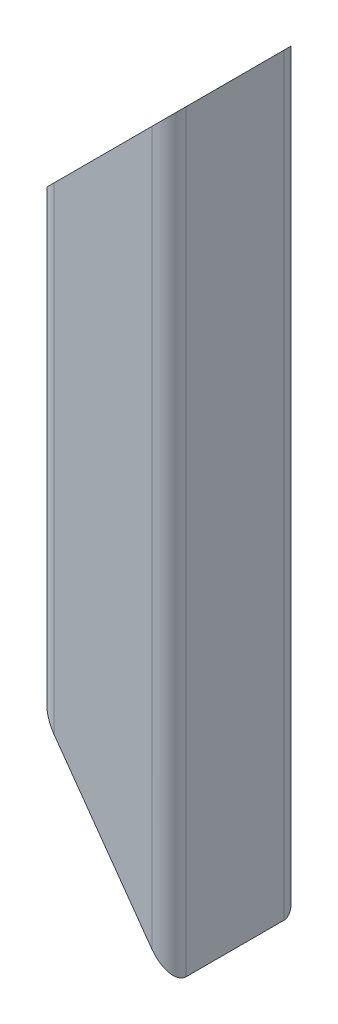
ISO-10303-21;
HEADER;
FILE_DESCRIPTION(('STEP AP214'),'2;1');
FILE_NAME('part.step','',(''),(''),'','','');
FILE_SCHEMA(('AUTOMOTIVE_DESIGN { 1 0 10303 214 1 1 1 1 }'));
ENDSEC;
DATA;
#1=APPLICATION_CONTEXT('core data for automotive mechanical design processes');
#2=APPLICATION_PROTOCOL_DEFINITION('international standard','automotive_design',2000,#1);
#3=PRODUCT_CONTEXT('',#1,'mechanical');
#4=PRODUCT('Part','Part','',(#3));
#5=PRODUCT_RELATED_PRODUCT_CATEGORY('part','',(#4));
#6=PRODUCT_DEFINITION_FORMATION('','',#4);
#7=PRODUCT_DEFINITION_CONTEXT('part definition',#1,'design');
#8=PRODUCT_DEFINITION('design','',#6,#7);
#9=PRODUCT_DEFINITION_SHAPE('','',#8);
#10=(LENGTH_UNIT() NAMED_UNIT(*) SI_UNIT(.MILLI.,.METRE.));
#11=(NAMED_UNIT(*) PLANE_ANGLE_UNIT() SI_UNIT($,.RADIAN.));
#12=(NAMED_UNIT(*) SI_UNIT($,.STERADIAN.) SOLID_ANGLE_UNIT());
#13=UNCERTAINTY_MEASURE_WITH_UNIT(LENGTH_MEASURE(1.E-05),#10,'distance_accuracy_value','');
#14=(GEOMETRIC_REPRESENTATION_CONTEXT(3) GLOBAL_UNCERTAINTY_ASSIGNED_CONTEXT((#13)) GLOBAL_UNIT_ASSIGNED_CONTEXT((#10,
#11,#12)) REPRESENTATION_CONTEXT('',''));
#15=CARTESIAN_POINT('',(0.,0.,0.));
#16=DIRECTION('',(0.,0.,1.));
#17=DIRECTION('',(1.,0.,0.));
#18=AXIS2_PLACEMENT_3D('',#15,#16,#17);
#19=CARTESIAN_POINT('',(9.52499999999999,144.78,-6.22299999999999));
#20=DIRECTION('',(-1.,0.,0.));
#21=DIRECTION('',(0.,0.,1.));
#22=AXIS2_PLACEMENT_3D('',#19,#20,#21);
#23=PLANE('',#22);
#24=DIRECTION('',(0.,0.,1.));
#25=VECTOR('',#24,1.);
#26=CARTESIAN_POINT('',(9.52499999999999,141.605,-6.22299999999999));
#27=LINE('',#26,#25);
#28=CARTESIAN_POINT('',(9.525,141.605,-19.177));
#29=VERTEX_POINT('',#28);
#30=CARTESIAN_POINT('',(9.52499999999999,141.605,-6.22299999999999));
#31=VERTEX_POINT('',#30);
#32=EDGE_CURVE('E11',#29,#31,#27,.T.);
#33=ORIENTED_EDGE('',*,*,#32,.F.);
#34=DIRECTION('',(0.,-1.,0.));
#35=VECTOR('',#34,1.);
#36=CARTESIAN_POINT('',(9.525,144.78,-19.177));
#37=LINE('',#36,#35);
#38=CARTESIAN_POINT('',(9.525,4.44500000000002,-19.177));
#39=VERTEX_POINT('',#38);
#40=EDGE_CURVE('E204',#29,#39,#37,.T.);
#41=ORIENTED_EDGE('',*,*,#40,.T.);
#42=DIRECTION('',(0.,0.,-1.));
#43=VECTOR('',#42,1.);
#44=CARTESIAN_POINT('',(9.52499999999999,4.44500000000003,-6.22299999999989));
#45=LINE('',#44,#43);
#46=CARTESIAN_POINT('',(9.52499999999999,4.44500000000003,-6.22299999999999));
#47=VERTEX_POINT('',#46);
#48=EDGE_CURVE('E44',#47,#39,#45,.T.);
#49=ORIENTED_EDGE('',*,*,#48,.F.);
#50=DIRECTION('',(0.,-1.,0.));
#51=VECTOR('',#50,1.);
#52=CARTESIAN_POINT('',(9.52499999999999,144.78,-6.22299999999999));
#53=LINE('',#52,#51);
#54=EDGE_CURVE('E210',#31,#47,#53,.T.);
#55=ORIENTED_EDGE('',*,*,#54,.F.);
#56=EDGE_LOOP('',(#33,#41,#49,#55));
#57=FACE_BOUND('',#56,.T.);
#58=ADVANCED_FACE('F36',(#57),#23,.T.);
#59=CARTESIAN_POINT('',(6.477,144.78,-6.22299999999999));
#60=DIRECTION('',(0.,-1.,0.));
#61=DIRECTION('',(0.,0.,-1.));
#62=AXIS2_PLACEMENT_3D('',#59,#60,#61);
#63=CYLINDRICAL_SURFACE('',#62,3.048);
#64=CARTESIAN_POINT('',(6.477,138.557,-6.22299999999999));
#65=DIRECTION('',(0.707106781186554,-0.707106781186541,0.));
#66=DIRECTION('',(-0.707106781186541,-0.707106781186554,0.));
#67=AXIS2_PLACEMENT_3D('',#64,#65,#66);
#68=ELLIPSE('',#67,4.31052293811323,3.048);
#69=CARTESIAN_POINT('',(6.477,138.557,-3.17499999999999));
#70=VERTEX_POINT('',#69);
#71=EDGE_CURVE('E266',#31,#70,#68,.T.);
#72=ORIENTED_EDGE('',*,*,#71,.F.);
#73=ORIENTED_EDGE('',*,*,#54,.T.);
#74=CARTESIAN_POINT('',(6.477,8.71220000000003,-6.22299999999999));
#75=DIRECTION('',(0.813733471206735,0.581238193719096,0.));
#76=DIRECTION('',(0.581238193719096,-0.813733471206735,0.));
#77=AXIS2_PLACEMENT_3D('',#74,#75,#76);
#78=ELLIPSE('',#77,5.24397748278918,3.048);
#79=CARTESIAN_POINT('',(6.477,8.71220000000003,-3.17499999999999));
#80=VERTEX_POINT('',#79);
#81=EDGE_CURVE('E194',#80,#47,#78,.T.);
#82=ORIENTED_EDGE('',*,*,#81,.F.);
#83=DIRECTION('',(0.,-1.,0.));
#84=VECTOR('',#83,1.);
#85=CARTESIAN_POINT('',(6.477,144.78,-3.17499999999999));
#86=LINE('',#85,#84);
#87=EDGE_CURVE('E213',#70,#80,#86,.T.);
#88=ORIENTED_EDGE('',*,*,#87,.F.);
#89=EDGE_LOOP('',(#72,#73,#82,#88));
#90=FACE_BOUND('',#89,.T.);
#91=ADVANCED_FACE('F309',(#90),#63,.F.);
#92=CARTESIAN_POINT('',(-6.477,144.78,-3.17499999999999));
#93=DIRECTION('',(0.,0.,-1.));
#94=DIRECTION('',(-1.,0.,0.));
#95=AXIS2_PLACEMENT_3D('',#92,#93,#94);
#96=PLANE('',#95);
#97=DIRECTION('',(-0.707106781186541,-0.707106781186554,0.));
#98=VECTOR('',#97,1.);
#99=CARTESIAN_POINT('',(3.11150000000017,135.1915,-3.17499999999999));
#100=LINE('',#99,#98);
#101=CARTESIAN_POINT('',(-6.477,125.603,-3.17499999999999));
#102=VERTEX_POINT('',#101);
#103=EDGE_CURVE('E264',#70,#102,#100,.T.);
#104=ORIENTED_EDGE('',*,*,#103,.F.);
#105=ORIENTED_EDGE('',*,*,#87,.T.);
#106=DIRECTION('',(0.581238193719096,-0.813733471206735,0.));
#107=VECTOR('',#106,1.);
#108=CARTESIAN_POINT('',(-62.2557432432432,104.938040540541,-3.17499999999999));
#109=LINE('',#108,#107);
#110=CARTESIAN_POINT('',(-6.477,26.8478,-3.17499999999999));
#111=VERTEX_POINT('',#110);
#112=EDGE_CURVE('E279',#111,#80,#109,.T.);
#113=ORIENTED_EDGE('',*,*,#112,.F.);
#114=DIRECTION('',(0.,-1.,0.));
#115=VECTOR('',#114,1.);
#116=CARTESIAN_POINT('',(-6.477,144.78,-3.175));
#117=LINE('',#116,#115);
#118=EDGE_CURVE('E222',#102,#111,#117,.T.);
#119=ORIENTED_EDGE('',*,*,#118,.F.);
#120=EDGE_LOOP('',(#104,#105,#113,#119));
#121=FACE_BOUND('',#120,.T.);
#122=ADVANCED_FACE('F314',(#121),#96,.T.);
#123=CARTESIAN_POINT('',(-6.477,144.78,-6.22299999999999));
#124=DIRECTION('',(0.,-1.,0.));
#125=DIRECTION('',(0.,0.,-1.));
#126=AXIS2_PLACEMENT_3D('',#123,#124,#125);
#127=CYLINDRICAL_SURFACE('',#126,3.04799999999999);
#128=CARTESIAN_POINT('',(-6.477,125.603,-6.22299999999999));
#129=DIRECTION('',(0.707106781186554,-0.707106781186541,0.));
#130=DIRECTION('',(-0.707106781186541,-0.707106781186554,0.));
#131=AXIS2_PLACEMENT_3D('',#128,#129,#130);
#132=ELLIPSE('',#131,4.31052293811322,3.04799999999999);
#133=CARTESIAN_POINT('',(-9.52499999999999,122.555,-6.22299999999999));
#134=VERTEX_POINT('',#133);
#135=EDGE_CURVE('E262',#102,#134,#132,.T.);
#136=ORIENTED_EDGE('',*,*,#135,.F.);
#137=ORIENTED_EDGE('',*,*,#118,.T.);
#138=CARTESIAN_POINT('',(-6.477,26.8478,-6.22299999999999));
#139=DIRECTION('',(0.813733471206735,0.581238193719096,0.));
#140=DIRECTION('',(0.581238193719096,-0.813733471206735,0.));
#141=AXIS2_PLACEMENT_3D('',#138,#139,#140);
#142=ELLIPSE('',#141,5.24397748278917,3.04799999999999);
#143=CARTESIAN_POINT('',(-9.52499999999999,31.115,-6.22299999999999));
#144=VERTEX_POINT('',#143);
#145=EDGE_CURVE('E277',#144,#111,#142,.T.);
#146=ORIENTED_EDGE('',*,*,#145,.F.);
#147=DIRECTION('',(0.,-1.,0.));
#148=VECTOR('',#147,1.);
#149=CARTESIAN_POINT('',(-9.52499999999999,144.78,-6.22299999999999));
#150=LINE('',#149,#148);
#151=EDGE_CURVE('E225',#134,#144,#150,.T.);
#152=ORIENTED_EDGE('',*,*,#151,.F.);
#153=EDGE_LOOP('',(#136,#137,#146,#152));
#154=FACE_BOUND('',#153,.T.);
#155=ADVANCED_FACE('F322',(#154),#127,.F.);
#156=CARTESIAN_POINT('',(-9.52499999999999,144.78,-6.22299999999999));
#157=DIRECTION('',(1.,0.,0.));
#158=DIRECTION('',(0.,0.,-1.));
#159=AXIS2_PLACEMENT_3D('',#156,#157,#158);
#160=PLANE('',#159);
#161=DIRECTION('',(0.,0.,-1.));
#162=VECTOR('',#161,1.);
#163=CARTESIAN_POINT('',(-9.52499999999999,122.555,-6.22299999999999));
#164=LINE('',#163,#162);
#165=CARTESIAN_POINT('',(-9.52499999999999,122.555,-19.177));
#166=VERTEX_POINT('',#165);
#167=EDGE_CURVE('E260',#134,#166,#164,.T.);
#168=ORIENTED_EDGE('',*,*,#167,.F.);
#169=ORIENTED_EDGE('',*,*,#151,.T.);
#170=DIRECTION('',(0.,0.,1.));
#171=VECTOR('',#170,1.);
#172=CARTESIAN_POINT('',(-9.52499999999999,31.115,-6.22299999999999));
#173=LINE('',#172,#171);
#174=CARTESIAN_POINT('',(-9.52499999999999,31.115,-19.177));
#175=VERTEX_POINT('',#174);
#176=EDGE_CURVE('E275',#175,#144,#173,.T.);
#177=ORIENTED_EDGE('',*,*,#176,.F.);
#178=DIRECTION('',(0.,-1.,0.));
#179=VECTOR('',#178,1.);
#180=CARTESIAN_POINT('',(-9.525,144.78,-19.177));
#181=LINE('',#180,#179);
#182=EDGE_CURVE('E228',#166,#175,#181,.T.);
#183=ORIENTED_EDGE('',*,*,#182,.F.);
#184=EDGE_LOOP('',(#168,#169,#177,#183));
#185=FACE_BOUND('',#184,.T.);
#186=ADVANCED_FACE('F326',(#185),#160,.T.);
#187=CARTESIAN_POINT('',(-6.47700000000001,144.78,-19.177));
#188=DIRECTION('',(0.,-1.,0.));
#189=DIRECTION('',(0.,0.,-1.));
#190=AXIS2_PLACEMENT_3D('',#187,#188,#189);
#191=CYLINDRICAL_SURFACE('',#190,3.04799999999999);
#192=CARTESIAN_POINT('',(-6.47700000000001,125.603,-19.177));
#193=DIRECTION('',(0.707106781186554,-0.707106781186541,0.));
#194=DIRECTION('',(-0.707106781186541,-0.707106781186554,0.));
#195=AXIS2_PLACEMENT_3D('',#192,#193,#194);
#196=ELLIPSE('',#195,4.31052293811322,3.04799999999999);
#197=CARTESIAN_POINT('',(-6.477,125.603,-22.225));
#198=VERTEX_POINT('',#197);
#199=EDGE_CURVE('E258',#166,#198,#196,.T.);
#200=ORIENTED_EDGE('',*,*,#199,.F.);
#201=ORIENTED_EDGE('',*,*,#182,.T.);
#202=CARTESIAN_POINT('',(-6.47700000000001,26.8478,-19.177));
#203=DIRECTION('',(0.813733471206735,0.581238193719096,0.));
#204=DIRECTION('',(0.581238193719096,-0.813733471206735,0.));
#205=AXIS2_PLACEMENT_3D('',#202,#203,#204);
#206=ELLIPSE('',#205,5.24397748278917,3.04799999999999);
#207=CARTESIAN_POINT('',(-6.477,26.8478,-22.225));
#208=VERTEX_POINT('',#207);
#209=EDGE_CURVE('E273',#208,#175,#206,.T.);
#210=ORIENTED_EDGE('',*,*,#209,.F.);
#211=DIRECTION('',(0.,-1.,0.));
#212=VECTOR('',#211,1.);
#213=CARTESIAN_POINT('',(-6.477,144.78,-22.225));
#214=LINE('',#213,#212);
#215=EDGE_CURVE('E231',#198,#208,#214,.T.);
#216=ORIENTED_EDGE('',*,*,#215,.F.);
#217=EDGE_LOOP('',(#200,#201,#210,#216));
#218=FACE_BOUND('',#217,.T.);
#219=ADVANCED_FACE('F330',(#218),#191,.F.);
#220=CARTESIAN_POINT('',(-6.477,144.78,-22.225));
#221=DIRECTION('',(0.,0.,1.));
#222=DIRECTION('',(1.,0.,0.));
#223=AXIS2_PLACEMENT_3D('',#220,#221,#222);
#224=PLANE('',#223);
#225=DIRECTION('',(0.707106781186541,0.707106781186554,0.));
#226=VECTOR('',#225,1.);
#227=CARTESIAN_POINT('',(3.11150000000017,135.1915,-22.225));
#228=LINE('',#227,#226);
#229=CARTESIAN_POINT('',(6.477,138.557,-22.225));
#230=VERTEX_POINT('',#229);
#231=EDGE_CURVE('E256',#198,#230,#228,.T.);
#232=ORIENTED_EDGE('',*,*,#231,.F.);
#233=ORIENTED_EDGE('',*,*,#215,.T.);
#234=DIRECTION('',(-0.581238193719096,0.813733471206735,0.));
#235=VECTOR('',#234,1.);
#236=CARTESIAN_POINT('',(-62.2557432432432,104.938040540541,-22.225));
#237=LINE('',#236,#235);
#238=CARTESIAN_POINT('',(6.47699999999999,8.71220000000003,-22.225));
#239=VERTEX_POINT('',#238);
#240=EDGE_CURVE('E207',#239,#208,#237,.T.);
#241=ORIENTED_EDGE('',*,*,#240,.F.);
#242=DIRECTION('',(0.,-1.,0.));
#243=VECTOR('',#242,1.);
#244=CARTESIAN_POINT('',(6.477,144.78,-22.225));
#245=LINE('',#244,#243);
#246=EDGE_CURVE('E206',#230,#239,#245,.T.);
#247=ORIENTED_EDGE('',*,*,#246,.F.);
#248=EDGE_LOOP('',(#232,#233,#241,#247));
#249=FACE_BOUND('',#248,.T.);
#250=ADVANCED_FACE('F334',(#249),#224,.T.);
#251=CARTESIAN_POINT('',(6.477,144.78,-19.177));
#252=DIRECTION('',(0.,-1.,0.));
#253=DIRECTION('',(0.,0.,-1.));
#254=AXIS2_PLACEMENT_3D('',#251,#252,#253);
#255=CYLINDRICAL_SURFACE('',#254,3.048);
#256=CARTESIAN_POINT('',(6.477,138.557,-19.177));
#257=DIRECTION('',(0.707106781186554,-0.707106781186541,0.));
#258=DIRECTION('',(-0.707106781186541,-0.707106781186554,0.));
#259=AXIS2_PLACEMENT_3D('',#256,#257,#258);
#260=ELLIPSE('',#259,4.31052293811323,3.048);
#261=EDGE_CURVE('E254',#230,#29,#260,.T.);
#262=ORIENTED_EDGE('',*,*,#261,.F.);
#263=ORIENTED_EDGE('',*,*,#246,.T.);
#264=CARTESIAN_POINT('',(6.477,8.71220000000003,-19.177));
#265=DIRECTION('',(0.813733471206735,0.581238193719096,0.));
#266=DIRECTION('',(0.581238193719096,-0.813733471206735,0.));
#267=AXIS2_PLACEMENT_3D('',#264,#265,#266);
#268=ELLIPSE('',#267,5.24397748278919,3.048);
#269=EDGE_CURVE('E164',#39,#239,#268,.T.);
#270=ORIENTED_EDGE('',*,*,#269,.F.);
#271=ORIENTED_EDGE('',*,*,#40,.F.);
#272=EDGE_LOOP('',(#262,#263,#270,#271));
#273=FACE_BOUND('',#272,.T.);
#274=ADVANCED_FACE('F203',(#273),#255,.F.);
#275=CARTESIAN_POINT('',(12.7,0.,-25.4));
#276=DIRECTION('',(0.813733471206735,0.581238193719096,0.));
#277=DIRECTION('',(-0.581238193719096,0.813733471206735,0.));
#278=AXIS2_PLACEMENT_3D('',#275,#276,#277);
#279=PLANE('',#278);
#280=ORIENTED_EDGE('',*,*,#269,.T.);
#281=ORIENTED_EDGE('',*,*,#240,.T.);
#282=ORIENTED_EDGE('',*,*,#209,.T.);
#283=ORIENTED_EDGE('',*,*,#176,.T.);
#284=ORIENTED_EDGE('',*,*,#145,.T.);
#285=ORIENTED_EDGE('',*,*,#112,.T.);
#286=ORIENTED_EDGE('',*,*,#81,.T.);
#287=ORIENTED_EDGE('',*,*,#48,.T.);
#288=EDGE_LOOP('',(#280,#281,#282,#283,#284,#285,#286,#287));
#289=FACE_BOUND('',#288,.T.);
#290=DIRECTION('',(-0.581238193719096,0.813733471206735,0.));
#291=VECTOR('',#290,1.);
#292=CARTESIAN_POINT('',(12.7,0.,0.));
#293=LINE('',#292,#291);
#294=CARTESIAN_POINT('',(9.398,4.6228,0.));
#295=VERTEX_POINT('',#294);
#296=CARTESIAN_POINT('',(-9.39799999999999,30.9372,0.));
#297=VERTEX_POINT('',#296);
#298=EDGE_CURVE('E145',#295,#297,#293,.T.);
#299=ORIENTED_EDGE('',*,*,#298,.T.);
#300=CARTESIAN_POINT('',(-9.398,30.9372,-3.302));
#301=DIRECTION('',(0.813733471206735,0.581238193719096,0.));
#302=DIRECTION('',(0.581238193719096,-0.813733471206735,0.));
#303=AXIS2_PLACEMENT_3D('',#300,#301,#302);
#304=ELLIPSE('',#303,5.68097560635495,3.302);
#305=CARTESIAN_POINT('',(-12.7,35.56,-3.302));
#306=VERTEX_POINT('',#305);
#307=EDGE_CURVE('E148',#306,#297,#304,.T.);
#308=ORIENTED_EDGE('',*,*,#307,.F.);
#309=DIRECTION('',(0.,0.,1.));
#310=VECTOR('',#309,1.);
#311=CARTESIAN_POINT('',(-12.7,35.56,-25.4));
#312=LINE('',#311,#310);
#313=CARTESIAN_POINT('',(-12.7,35.56,-22.098));
#314=VERTEX_POINT('',#313);
#315=EDGE_CURVE('E283',#314,#306,#312,.T.);
#316=ORIENTED_EDGE('',*,*,#315,.F.);
#317=CARTESIAN_POINT('',(-9.398,30.9372,-22.098));
#318=DIRECTION('',(0.813733471206735,0.581238193719096,0.));
#319=DIRECTION('',(0.581238193719096,-0.813733471206735,0.));
#320=AXIS2_PLACEMENT_3D('',#317,#318,#319);
#321=ELLIPSE('',#320,5.68097560635495,3.302);
#322=CARTESIAN_POINT('',(-9.39799999999999,30.9372,-25.4));
#323=VERTEX_POINT('',#322);
#324=EDGE_CURVE('E163',#323,#314,#321,.T.);
#325=ORIENTED_EDGE('',*,*,#324,.F.);
#326=DIRECTION('',(-0.581238193719096,0.813733471206735,0.));
#327=VECTOR('',#326,1.);
#328=CARTESIAN_POINT('',(12.7,0.,-25.4));
#329=LINE('',#328,#327);
#330=CARTESIAN_POINT('',(9.398,4.6228,-25.4));
#331=VERTEX_POINT('',#330);
#332=EDGE_CURVE('E154',#331,#323,#329,.T.);
#333=ORIENTED_EDGE('',*,*,#332,.F.);
#334=CARTESIAN_POINT('',(9.39799999999999,4.62280000000001,-22.098));
#335=DIRECTION('',(0.813733471206735,0.581238193719096,0.));
#336=DIRECTION('',(0.581238193719096,-0.813733471206735,0.));
#337=AXIS2_PLACEMENT_3D('',#334,#335,#336);
#338=ELLIPSE('',#337,5.68097560635495,3.302);
#339=CARTESIAN_POINT('',(12.7,0.,-22.098));
#340=VERTEX_POINT('',#339);
#341=EDGE_CURVE('E247',#340,#331,#338,.T.);
#342=ORIENTED_EDGE('',*,*,#341,.F.);
#343=DIRECTION('',(0.,0.,-1.));
#344=VECTOR('',#343,1.);
#345=CARTESIAN_POINT('',(12.7,0.,-3.302));
#346=LINE('',#345,#344);
#347=CARTESIAN_POINT('',(12.7,0.,-3.302));
#348=VERTEX_POINT('',#347);
#349=EDGE_CURVE('E235',#348,#340,#346,.T.);
#350=ORIENTED_EDGE('',*,*,#349,.F.);
#351=CARTESIAN_POINT('',(9.398,4.62280000000001,-3.302));
#352=DIRECTION('',(0.813733471206735,0.581238193719096,0.));
#353=DIRECTION('',(0.581238193719096,-0.813733471206735,0.));
#354=AXIS2_PLACEMENT_3D('',#351,#352,#353);
#355=ELLIPSE('',#354,5.68097560635495,3.302);
#356=EDGE_CURVE('E59',#295,#348,#355,.T.);
#357=ORIENTED_EDGE('',*,*,#356,.F.);
#358=EDGE_LOOP('',(#299,#308,#316,#325,#333,#342,#350,#357));
#359=FACE_BOUND('',#358,.T.);
#360=ADVANCED_FACE('F147',(#289,#359),#279,.F.);
#361=CARTESIAN_POINT('',(12.7,144.78,-25.4));
#362=DIRECTION('',(0.707106781186554,-0.707106781186541,0.));
#363=DIRECTION('',(0.707106781186541,0.707106781186554,0.));
#364=AXIS2_PLACEMENT_3D('',#361,#362,#363);
#365=PLANE('',#364);
#366=ORIENTED_EDGE('',*,*,#261,.T.);
#367=ORIENTED_EDGE('',*,*,#32,.T.);
#368=ORIENTED_EDGE('',*,*,#71,.T.);
#369=ORIENTED_EDGE('',*,*,#103,.T.);
#370=ORIENTED_EDGE('',*,*,#135,.T.);
#371=ORIENTED_EDGE('',*,*,#167,.T.);
#372=ORIENTED_EDGE('',*,*,#199,.T.);
#373=ORIENTED_EDGE('',*,*,#231,.T.);
#374=EDGE_LOOP('',(#366,#367,#368,#369,#370,#371,#372,#373));
#375=FACE_BOUND('',#374,.T.);
#376=DIRECTION('',(0.,0.,-1.));
#377=VECTOR('',#376,1.);
#378=CARTESIAN_POINT('',(12.7,144.78,-3.302));
#379=LINE('',#378,#377);
#380=CARTESIAN_POINT('',(12.7,144.78,-3.302));
#381=VERTEX_POINT('',#380);
#382=CARTESIAN_POINT('',(12.7,144.78,-22.098));
#383=VERTEX_POINT('',#382);
#384=EDGE_CURVE('E172',#381,#383,#379,.T.);
#385=ORIENTED_EDGE('',*,*,#384,.T.);
#386=CARTESIAN_POINT('',(9.39799999999999,141.478,-22.098));
#387=DIRECTION('',(0.707106781186554,-0.707106781186541,0.));
#388=DIRECTION('',(-0.707106781186541,-0.707106781186554,0.));
#389=AXIS2_PLACEMENT_3D('',#386,#387,#388);
#390=ELLIPSE('',#389,4.669733182956,3.302);
#391=CARTESIAN_POINT('',(9.398,141.478,-25.4));
#392=VERTEX_POINT('',#391);
#393=EDGE_CURVE('E216',#392,#383,#390,.T.);
#394=ORIENTED_EDGE('',*,*,#393,.F.);
#395=DIRECTION('',(0.707106781186541,0.707106781186554,0.));
#396=VECTOR('',#395,1.);
#397=CARTESIAN_POINT('',(12.7,144.78,-25.4));
#398=LINE('',#397,#396);
#399=CARTESIAN_POINT('',(-9.39800000000001,122.682,-25.4));
#400=VERTEX_POINT('',#399);
#401=EDGE_CURVE('E288',#400,#392,#398,.T.);
#402=ORIENTED_EDGE('',*,*,#401,.F.);
#403=CARTESIAN_POINT('',(-9.398,122.682,-22.098));
#404=DIRECTION('',(0.707106781186554,-0.707106781186541,0.));
#405=DIRECTION('',(-0.707106781186541,-0.707106781186554,0.));
#406=AXIS2_PLACEMENT_3D('',#403,#404,#405);
#407=ELLIPSE('',#406,4.669733182956,3.302);
#408=CARTESIAN_POINT('',(-12.7,119.38,-22.098));
#409=VERTEX_POINT('',#408);
#410=EDGE_CURVE('E249',#409,#400,#407,.T.);
#411=ORIENTED_EDGE('',*,*,#410,.F.);
#412=DIRECTION('',(0.,0.,1.));
#413=VECTOR('',#412,1.);
#414=CARTESIAN_POINT('',(-12.7,119.38,-25.4));
#415=LINE('',#414,#413);
#416=CARTESIAN_POINT('',(-12.7,119.38,-3.302));
#417=VERTEX_POINT('',#416);
#418=EDGE_CURVE('E282',#409,#417,#415,.T.);
#419=ORIENTED_EDGE('',*,*,#418,.T.);
#420=CARTESIAN_POINT('',(-9.398,122.682,-3.302));
#421=DIRECTION('',(0.707106781186554,-0.707106781186541,0.));
#422=DIRECTION('',(-0.707106781186541,-0.707106781186554,0.));
#423=AXIS2_PLACEMENT_3D('',#420,#421,#422);
#424=ELLIPSE('',#423,4.669733182956,3.302);
#425=CARTESIAN_POINT('',(-9.398,122.682,0.));
#426=VERTEX_POINT('',#425);
#427=EDGE_CURVE('E51',#426,#417,#424,.T.);
#428=ORIENTED_EDGE('',*,*,#427,.F.);
#429=DIRECTION('',(0.707106781186541,0.707106781186554,0.));
#430=VECTOR('',#429,1.);
#431=CARTESIAN_POINT('',(12.7,144.78,0.));
#432=LINE('',#431,#430);
#433=CARTESIAN_POINT('',(9.398,141.478,0.));
#434=VERTEX_POINT('',#433);
#435=EDGE_CURVE('E167',#426,#434,#432,.T.);
#436=ORIENTED_EDGE('',*,*,#435,.T.);
#437=CARTESIAN_POINT('',(9.398,141.478,-3.302));
#438=DIRECTION('',(0.707106781186554,-0.707106781186541,0.));
#439=DIRECTION('',(-0.707106781186541,-0.707106781186554,0.));
#440=AXIS2_PLACEMENT_3D('',#437,#438,#439);
#441=ELLIPSE('',#440,4.669733182956,3.302);
#442=EDGE_CURVE('E211',#381,#434,#441,.T.);
#443=ORIENTED_EDGE('',*,*,#442,.F.);
#444=EDGE_LOOP('',(#385,#394,#402,#411,#419,#428,#436,#443));
#445=FACE_BOUND('',#444,.T.);
#446=ADVANCED_FACE('F293',(#375,#445),#365,.F.);
#447=CARTESIAN_POINT('',(9.398,144.78,-3.302));
#448=DIRECTION('',(0.,-1.,0.));
#449=DIRECTION('',(0.,0.,-1.));
#450=AXIS2_PLACEMENT_3D('',#447,#448,#449);
#451=CYLINDRICAL_SURFACE('',#450,3.302);
#452=DIRECTION('',(0.,-1.,0.));
#453=VECTOR('',#452,1.);
#454=CARTESIAN_POINT('',(12.7,144.78,-3.302));
#455=LINE('',#454,#453);
#456=EDGE_CURVE('E187',#381,#348,#455,.T.);
#457=ORIENTED_EDGE('',*,*,#456,.F.);
#458=ORIENTED_EDGE('',*,*,#442,.T.);
#459=DIRECTION('',(0.,-1.,0.));
#460=VECTOR('',#459,1.);
#461=CARTESIAN_POINT('',(9.398,144.78,0.));
#462=LINE('',#461,#460);
#463=EDGE_CURVE('E168',#434,#295,#462,.T.);
#464=ORIENTED_EDGE('',*,*,#463,.T.);
#465=ORIENTED_EDGE('',*,*,#356,.T.);
#466=EDGE_LOOP('',(#457,#458,#464,#465));
#467=FACE_BOUND('',#466,.T.);
#468=ADVANCED_FACE('F38',(#467),#451,.T.);
#469=CARTESIAN_POINT('',(12.7,144.78,-3.302));
#470=DIRECTION('',(-1.,0.,0.));
#471=DIRECTION('',(0.,0.,1.));
#472=AXIS2_PLACEMENT_3D('',#469,#470,#471);
#473=PLANE('',#472);
#474=ORIENTED_EDGE('',*,*,#349,.T.);
#475=DIRECTION('',(0.,-1.,0.));
#476=VECTOR('',#475,1.);
#477=CARTESIAN_POINT('',(12.7,144.78,-22.098));
#478=LINE('',#477,#476);
#479=EDGE_CURVE('E184',#383,#340,#478,.T.);
#480=ORIENTED_EDGE('',*,*,#479,.F.);
#481=ORIENTED_EDGE('',*,*,#384,.F.);
#482=ORIENTED_EDGE('',*,*,#456,.T.);
#483=EDGE_LOOP('',(#474,#480,#481,#482));
#484=FACE_BOUND('',#483,.T.);
#485=ADVANCED_FACE('F239',(#484),#473,.F.);
#486=CARTESIAN_POINT('',(9.39799999999999,144.78,-22.098));
#487=DIRECTION('',(0.,-1.,0.));
#488=DIRECTION('',(0.,0.,-1.));
#489=AXIS2_PLACEMENT_3D('',#486,#487,#488);
#490=CYLINDRICAL_SURFACE('',#489,3.302);
#491=DIRECTION('',(0.,-1.,0.));
#492=VECTOR('',#491,1.);
#493=CARTESIAN_POINT('',(9.398,144.78,-25.4));
#494=LINE('',#493,#492);
#495=EDGE_CURVE('E181',#392,#331,#494,.T.);
#496=ORIENTED_EDGE('',*,*,#495,.F.);
#497=ORIENTED_EDGE('',*,*,#393,.T.);
#498=ORIENTED_EDGE('',*,*,#479,.T.);
#499=ORIENTED_EDGE('',*,*,#341,.T.);
#500=EDGE_LOOP('',(#496,#497,#498,#499));
#501=FACE_BOUND('',#500,.T.);
#502=ADVANCED_FACE('F246',(#501),#490,.T.);
#503=CARTESIAN_POINT('',(-9.398,144.78,-25.4));
#504=DIRECTION('',(0.,0.,1.));
#505=DIRECTION('',(1.,0.,0.));
#506=AXIS2_PLACEMENT_3D('',#503,#504,#505);
#507=PLANE('',#506);
#508=DIRECTION('',(0.,-1.,0.));
#509=VECTOR('',#508,1.);
#510=CARTESIAN_POINT('',(-9.398,144.78,-25.4));
#511=LINE('',#510,#509);
#512=EDGE_CURVE('E178',#400,#323,#511,.T.);
#513=ORIENTED_EDGE('',*,*,#512,.F.);
#514=ORIENTED_EDGE('',*,*,#401,.T.);
#515=ORIENTED_EDGE('',*,*,#495,.T.);
#516=ORIENTED_EDGE('',*,*,#332,.T.);
#517=EDGE_LOOP('',(#513,#514,#515,#516));
#518=FACE_BOUND('',#517,.T.);
#519=ADVANCED_FACE('F292',(#518),#507,.F.);
#520=CARTESIAN_POINT('',(-9.398,144.78,-22.098));
#521=DIRECTION('',(0.,-1.,0.));
#522=DIRECTION('',(0.,0.,-1.));
#523=AXIS2_PLACEMENT_3D('',#520,#521,#522);
#524=CYLINDRICAL_SURFACE('',#523,3.302);
#525=DIRECTION('',(0.,-1.,0.));
#526=VECTOR('',#525,1.);
#527=CARTESIAN_POINT('',(-12.7,144.78,-22.098));
#528=LINE('',#527,#526);
#529=EDGE_CURVE('E170',#409,#314,#528,.T.);
#530=ORIENTED_EDGE('',*,*,#529,.F.);
#531=ORIENTED_EDGE('',*,*,#410,.T.);
#532=ORIENTED_EDGE('',*,*,#512,.T.);
#533=ORIENTED_EDGE('',*,*,#324,.T.);
#534=EDGE_LOOP('',(#530,#531,#532,#533));
#535=FACE_BOUND('',#534,.T.);
#536=ADVANCED_FACE('F297',(#535),#524,.T.);
#537=CARTESIAN_POINT('',(-12.7,144.78,-3.302));
#538=DIRECTION('',(1.,0.,0.));
#539=DIRECTION('',(0.,0.,-1.));
#540=AXIS2_PLACEMENT_3D('',#537,#538,#539);
#541=PLANE('',#540);
#542=DIRECTION('',(0.,-1.,0.));
#543=VECTOR('',#542,1.);
#544=CARTESIAN_POINT('',(-12.7,144.78,-3.302));
#545=LINE('',#544,#543);
#546=EDGE_CURVE('E162',#417,#306,#545,.T.);
#547=ORIENTED_EDGE('',*,*,#546,.F.);
#548=ORIENTED_EDGE('',*,*,#418,.F.);
#549=ORIENTED_EDGE('',*,*,#529,.T.);
#550=ORIENTED_EDGE('',*,*,#315,.T.);
#551=EDGE_LOOP('',(#547,#548,#549,#550));
#552=FACE_BOUND('',#551,.T.);
#553=ADVANCED_FACE('F299',(#552),#541,.F.);
#554=CARTESIAN_POINT('',(-9.398,144.78,-3.302));
#555=DIRECTION('',(0.,-1.,0.));
#556=DIRECTION('',(0.,0.,-1.));
#557=AXIS2_PLACEMENT_3D('',#554,#555,#556);
#558=CYLINDRICAL_SURFACE('',#557,3.302);
#559=DIRECTION('',(0.,-1.,0.));
#560=VECTOR('',#559,1.);
#561=CARTESIAN_POINT('',(-9.398,144.78,0.));
#562=LINE('',#561,#560);
#563=EDGE_CURVE('E160',#426,#297,#562,.T.);
#564=ORIENTED_EDGE('',*,*,#563,.F.);
#565=ORIENTED_EDGE('',*,*,#427,.T.);
#566=ORIENTED_EDGE('',*,*,#546,.T.);
#567=ORIENTED_EDGE('',*,*,#307,.T.);
#568=EDGE_LOOP('',(#564,#565,#566,#567));
#569=FACE_BOUND('',#568,.T.);
#570=ADVANCED_FACE('F159',(#569),#558,.T.);
#571=CARTESIAN_POINT('',(-9.398,144.78,0.));
#572=DIRECTION('',(0.,0.,-1.));
#573=DIRECTION('',(-1.,0.,0.));
#574=AXIS2_PLACEMENT_3D('',#571,#572,#573);
#575=PLANE('',#574);
#576=ORIENTED_EDGE('',*,*,#463,.F.);
#577=ORIENTED_EDGE('',*,*,#435,.F.);
#578=ORIENTED_EDGE('',*,*,#563,.T.);
#579=ORIENTED_EDGE('',*,*,#298,.F.);
#580=EDGE_LOOP('',(#576,#577,#578,#579));
#581=FACE_BOUND('',#580,.T.);
#582=ADVANCED_FACE('F166',(#581),#575,.F.);
#583=CLOSED_SHELL('',(#58,#91,#122,#155,#186,#219,#250,#274,#360,#446,#468,#485,#502,#519,#536,
#553,#570,#582));
#584=MANIFOLD_SOLID_BREP('B2',#583);
#585=ADVANCED_BREP_SHAPE_REPRESENTATION('',(#18,#584),#14);
#586=SHAPE_DEFINITION_REPRESENTATION(#9,#585);
ENDSEC;
END-ISO-10303-21;
